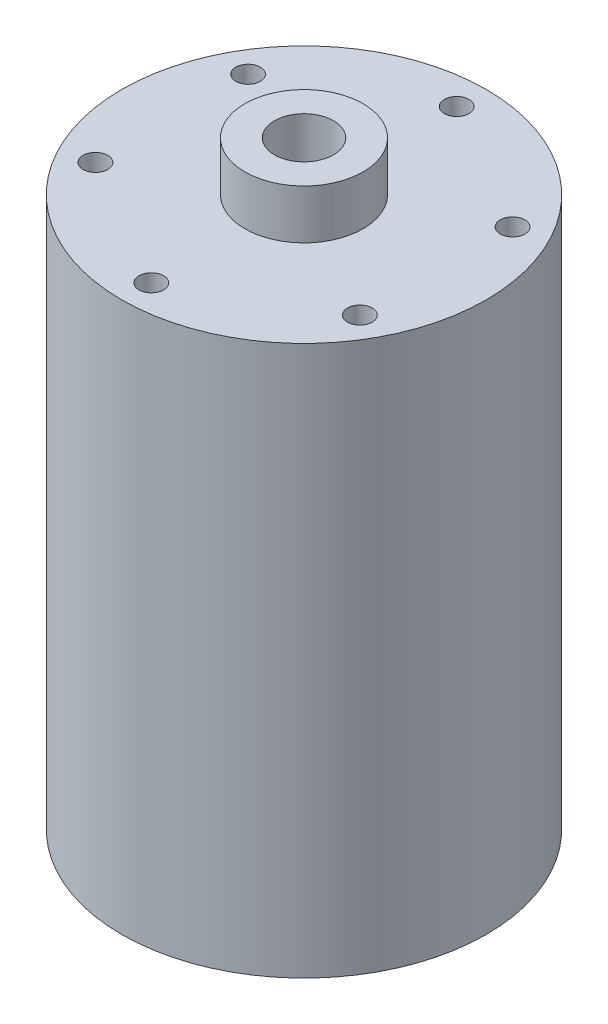
ISO-10303-21;
HEADER;
FILE_DESCRIPTION(('STEP AP214'),'2;1');
FILE_NAME('part.step','',(''),(''),'','','');
FILE_SCHEMA(('AUTOMOTIVE_DESIGN { 1 0 10303 214 1 1 1 1 }'));
ENDSEC;
DATA;
#1=APPLICATION_CONTEXT('core data for automotive mechanical design processes');
#2=APPLICATION_PROTOCOL_DEFINITION('international standard','automotive_design',2000,#1);
#3=PRODUCT_CONTEXT('',#1,'mechanical');
#4=PRODUCT('Part','Part','',(#3));
#5=PRODUCT_RELATED_PRODUCT_CATEGORY('part','',(#4));
#6=PRODUCT_DEFINITION_FORMATION('','',#4);
#7=PRODUCT_DEFINITION_CONTEXT('part definition',#1,'design');
#8=PRODUCT_DEFINITION('design','',#6,#7);
#9=PRODUCT_DEFINITION_SHAPE('','',#8);
#10=(LENGTH_UNIT() NAMED_UNIT(*) SI_UNIT(.MILLI.,.METRE.));
#11=(NAMED_UNIT(*) PLANE_ANGLE_UNIT() SI_UNIT($,.RADIAN.));
#12=(NAMED_UNIT(*) SI_UNIT($,.STERADIAN.) SOLID_ANGLE_UNIT());
#13=UNCERTAINTY_MEASURE_WITH_UNIT(LENGTH_MEASURE(1.E-05),#10,'distance_accuracy_value','');
#14=(GEOMETRIC_REPRESENTATION_CONTEXT(3) GLOBAL_UNCERTAINTY_ASSIGNED_CONTEXT((#13)) GLOBAL_UNIT_ASSIGNED_CONTEXT((#10,
#11,#12)) REPRESENTATION_CONTEXT('',''));
#15=CARTESIAN_POINT('',(0.,0.,0.));
#16=DIRECTION('',(0.,0.,1.));
#17=DIRECTION('',(1.,0.,0.));
#18=AXIS2_PLACEMENT_3D('',#15,#16,#17);
#19=CARTESIAN_POINT('',(0.,55.8,0.));
#20=DIRECTION('',(0.,-1.,0.));
#21=DIRECTION('',(0.,0.,-1.));
#22=AXIS2_PLACEMENT_3D('',#19,#20,#21);
#23=CYLINDRICAL_SURFACE('',#22,18.5);
#24=CARTESIAN_POINT('',(0.,55.8,0.));
#25=DIRECTION('',(0.,1.,0.));
#26=DIRECTION('',(0.,0.,1.));
#27=AXIS2_PLACEMENT_3D('',#24,#25,#26);
#28=CIRCLE('',#27,18.5);
#29=CARTESIAN_POINT('',(0.,55.8,18.5));
#30=VERTEX_POINT('',#29);
#31=EDGE_CURVE('E54',#30,#30,#28,.T.);
#32=ORIENTED_EDGE('',*,*,#31,.F.);
#33=EDGE_LOOP('',(#32));
#34=FACE_BOUND('',#33,.T.);
#35=CARTESIAN_POINT('',(0.,0.,0.));
#36=DIRECTION('',(0.,1.,0.));
#37=DIRECTION('',(0.,0.,1.));
#38=AXIS2_PLACEMENT_3D('',#35,#36,#37);
#39=CIRCLE('',#38,18.5);
#40=CARTESIAN_POINT('',(0.,0.,18.5));
#41=VERTEX_POINT('',#40);
#42=EDGE_CURVE('E48',#41,#41,#39,.T.);
#43=ORIENTED_EDGE('',*,*,#42,.T.);
#44=EDGE_LOOP('',(#43));
#45=FACE_BOUND('',#44,.T.);
#46=ADVANCED_FACE('F45',(#34,#45),#23,.T.);
#47=CARTESIAN_POINT('',(0.,55.8,0.));
#48=DIRECTION('',(0.,1.,0.));
#49=DIRECTION('',(0.,0.,1.));
#50=AXIS2_PLACEMENT_3D('',#47,#48,#49);
#51=PLANE('',#50);
#52=CARTESIAN_POINT('',(0.,55.8,-15.5));
#53=DIRECTION('',(0.,1.,0.));
#54=DIRECTION('',(0.,0.,1.));
#55=AXIS2_PLACEMENT_3D('',#52,#53,#54);
#56=CIRCLE('',#55,1.24999999999999);
#57=CARTESIAN_POINT('',(0.,55.8,-14.25));
#58=VERTEX_POINT('',#57);
#59=EDGE_CURVE('E86',#58,#58,#56,.T.);
#60=ORIENTED_EDGE('',*,*,#59,.F.);
#61=EDGE_LOOP('',(#60));
#62=FACE_BOUND('',#61,.T.);
#63=CARTESIAN_POINT('',(13.423393758659,55.8,-7.75000000000038));
#64=DIRECTION('',(0.,1.,0.));
#65=DIRECTION('',(0.,0.,1.));
#66=AXIS2_PLACEMENT_3D('',#63,#64,#65);
#67=CIRCLE('',#66,1.24999999999999);
#68=CARTESIAN_POINT('',(13.423393758659,55.8,-6.50000000000039));
#69=VERTEX_POINT('',#68);
#70=EDGE_CURVE('E85',#69,#69,#67,.T.);
#71=ORIENTED_EDGE('',*,*,#70,.F.);
#72=EDGE_LOOP('',(#71));
#73=FACE_BOUND('',#72,.T.);
#74=CARTESIAN_POINT('',(13.4233937586595,55.8,7.74999999999962));
#75=DIRECTION('',(0.,1.,0.));
#76=DIRECTION('',(0.,0.,1.));
#77=AXIS2_PLACEMENT_3D('',#74,#75,#76);
#78=CIRCLE('',#77,1.24999999999999);
#79=CARTESIAN_POINT('',(13.4233937586595,55.8,8.99999999999961));
#80=VERTEX_POINT('',#79);
#81=EDGE_CURVE('E101',#80,#80,#78,.T.);
#82=ORIENTED_EDGE('',*,*,#81,.F.);
#83=EDGE_LOOP('',(#82));
#84=FACE_BOUND('',#83,.T.);
#85=CARTESIAN_POINT('',(8.77276587265167E-13,55.8,15.5));
#86=DIRECTION('',(0.,1.,0.));
#87=DIRECTION('',(0.,0.,1.));
#88=AXIS2_PLACEMENT_3D('',#85,#86,#87);
#89=CIRCLE('',#88,1.24999999999999);
#90=CARTESIAN_POINT('',(8.77276587265167E-13,55.8,16.75));
#91=VERTEX_POINT('',#90);
#92=EDGE_CURVE('E109',#91,#91,#89,.T.);
#93=ORIENTED_EDGE('',*,*,#92,.F.);
#94=EDGE_LOOP('',(#93));
#95=FACE_BOUND('',#94,.T.);
#96=CARTESIAN_POINT('',(-13.4233937586581,55.8,7.75000000000039));
#97=DIRECTION('',(0.,1.,0.));
#98=DIRECTION('',(0.,0.,1.));
#99=AXIS2_PLACEMENT_3D('',#96,#97,#98);
#100=CIRCLE('',#99,1.24999999999999);
#101=CARTESIAN_POINT('',(-13.4233937586581,55.8,9.00000000000038));
#102=VERTEX_POINT('',#101);
#103=EDGE_CURVE('E117',#102,#102,#100,.T.);
#104=ORIENTED_EDGE('',*,*,#103,.F.);
#105=EDGE_LOOP('',(#104));
#106=FACE_BOUND('',#105,.T.);
#107=CARTESIAN_POINT('',(-13.4233937586586,55.8,-7.74999999999962));
#108=DIRECTION('',(0.,1.,0.));
#109=DIRECTION('',(0.,0.,1.));
#110=AXIS2_PLACEMENT_3D('',#107,#108,#109);
#111=CIRCLE('',#110,1.24999999999999);
#112=CARTESIAN_POINT('',(-13.4233937586586,55.8,-6.49999999999963));
#113=VERTEX_POINT('',#112);
#114=EDGE_CURVE('E125',#113,#113,#111,.T.);
#115=ORIENTED_EDGE('',*,*,#114,.F.);
#116=EDGE_LOOP('',(#115));
#117=FACE_BOUND('',#116,.T.);
#118=CARTESIAN_POINT('',(0.,55.8,0.));
#119=DIRECTION('',(0.,1.,0.));
#120=DIRECTION('',(0.,0.,1.));
#121=AXIS2_PLACEMENT_3D('',#118,#119,#120);
#122=CIRCLE('',#121,6.);
#123=CARTESIAN_POINT('',(0.,55.8,6.));
#124=VERTEX_POINT('',#123);
#125=EDGE_CURVE('E11',#124,#124,#122,.T.);
#126=ORIENTED_EDGE('',*,*,#125,.F.);
#127=EDGE_LOOP('',(#126));
#128=FACE_BOUND('',#127,.T.);
#129=ORIENTED_EDGE('',*,*,#31,.T.);
#130=EDGE_LOOP('',(#129));
#131=FACE_BOUND('',#130,.T.);
#132=ADVANCED_FACE('F148',(#62,#73,#84,#95,#106,#117,#128,#131),#51,.T.);
#133=CARTESIAN_POINT('',(0.,0.,0.));
#134=DIRECTION('',(0.,1.,0.));
#135=DIRECTION('',(0.,0.,1.));
#136=AXIS2_PLACEMENT_3D('',#133,#134,#135);
#137=PLANE('',#136);
#138=ORIENTED_EDGE('',*,*,#42,.F.);
#139=EDGE_LOOP('',(#138));
#140=FACE_BOUND('',#139,.T.);
#141=ADVANCED_FACE('F145',(#140),#137,.F.);
#142=CARTESIAN_POINT('',(0.,60.8,0.));
#143=DIRECTION('',(0.,-1.,0.));
#144=DIRECTION('',(0.,0.,-1.));
#145=AXIS2_PLACEMENT_3D('',#142,#143,#144);
#146=CYLINDRICAL_SURFACE('',#145,6.);
#147=CARTESIAN_POINT('',(0.,60.8,0.));
#148=DIRECTION('',(0.,1.,0.));
#149=DIRECTION('',(0.,0.,1.));
#150=AXIS2_PLACEMENT_3D('',#147,#148,#149);
#151=CIRCLE('',#150,6.);
#152=CARTESIAN_POINT('',(0.,60.8,6.));
#153=VERTEX_POINT('',#152);
#154=EDGE_CURVE('E133',#153,#153,#151,.T.);
#155=ORIENTED_EDGE('',*,*,#154,.F.);
#156=EDGE_LOOP('',(#155));
#157=FACE_BOUND('',#156,.T.);
#158=ORIENTED_EDGE('',*,*,#125,.T.);
#159=EDGE_LOOP('',(#158));
#160=FACE_BOUND('',#159,.T.);
#161=ADVANCED_FACE('F147',(#157,#160),#146,.T.);
#162=CARTESIAN_POINT('',(0.,60.8,0.));
#163=DIRECTION('',(0.,1.,0.));
#164=DIRECTION('',(0.,0.,1.));
#165=AXIS2_PLACEMENT_3D('',#162,#163,#164);
#166=PLANE('',#165);
#167=CARTESIAN_POINT('',(0.,60.8,0.));
#168=DIRECTION('',(0.,1.,0.));
#169=DIRECTION('',(0.,0.,1.));
#170=AXIS2_PLACEMENT_3D('',#167,#168,#169);
#171=CIRCLE('',#170,3.);
#172=CARTESIAN_POINT('',(0.,60.8,3.));
#173=VERTEX_POINT('',#172);
#174=EDGE_CURVE('E381',#173,#173,#171,.T.);
#175=ORIENTED_EDGE('',*,*,#174,.F.);
#176=EDGE_LOOP('',(#175));
#177=FACE_BOUND('',#176,.T.);
#178=ORIENTED_EDGE('',*,*,#154,.T.);
#179=EDGE_LOOP('',(#178));
#180=FACE_BOUND('',#179,.T.);
#181=ADVANCED_FACE('F153',(#177,#180),#166,.T.);
#182=CARTESIAN_POINT('',(-13.4233937586586,45.13,-7.74999999999962));
#183=DIRECTION('',(0.,1.,0.));
#184=DIRECTION('',(0.,0.,1.));
#185=AXIS2_PLACEMENT_3D('',#182,#183,#184);
#186=CONICAL_SURFACE('',#185,1.24999999999999,1.02974425867665);
#187=CARTESIAN_POINT('',(-13.4233937586586,44.3789242262156,-7.74999999999962));
#188=VERTEX_POINT('',#187);
#189=VERTEX_LOOP('',#188);
#190=FACE_BOUND('',#189,.T.);
#191=CARTESIAN_POINT('',(-13.4233937586586,45.13,-7.74999999999962));
#192=DIRECTION('',(0.,1.,0.));
#193=DIRECTION('',(0.,0.,1.));
#194=AXIS2_PLACEMENT_3D('',#191,#192,#193);
#195=CIRCLE('',#194,1.24999999999999);
#196=CARTESIAN_POINT('',(-13.4233937586586,45.13,-6.49999999999964));
#197=VERTEX_POINT('',#196);
#198=EDGE_CURVE('E129',#197,#197,#195,.T.);
#199=ORIENTED_EDGE('',*,*,#198,.T.);
#200=EDGE_LOOP('',(#199));
#201=FACE_BOUND('',#200,.T.);
#202=ADVANCED_FACE('F178',(#190,#201),#186,.F.);
#203=CARTESIAN_POINT('',(-13.4233937586586,55.8,-7.74999999999962));
#204=DIRECTION('',(0.,1.,0.));
#205=DIRECTION('',(0.,0.,1.));
#206=AXIS2_PLACEMENT_3D('',#203,#204,#205);
#207=CYLINDRICAL_SURFACE('',#206,1.24999999999999);
#208=ORIENTED_EDGE('',*,*,#198,.F.);
#209=EDGE_LOOP('',(#208));
#210=FACE_BOUND('',#209,.T.);
#211=ORIENTED_EDGE('',*,*,#114,.T.);
#212=EDGE_LOOP('',(#211));
#213=FACE_BOUND('',#212,.T.);
#214=ADVANCED_FACE('F172',(#210,#213),#207,.F.);
#215=CARTESIAN_POINT('',(-13.4233937586581,45.13,7.75000000000039));
#216=DIRECTION('',(0.,1.,0.));
#217=DIRECTION('',(0.,0.,1.));
#218=AXIS2_PLACEMENT_3D('',#215,#216,#217);
#219=CONICAL_SURFACE('',#218,1.24999999999999,1.02974425867665);
#220=CARTESIAN_POINT('',(-13.4233937586581,44.3789242262156,7.75000000000039));
#221=VERTEX_POINT('',#220);
#222=VERTEX_LOOP('',#221);
#223=FACE_BOUND('',#222,.T.);
#224=CARTESIAN_POINT('',(-13.4233937586581,45.13,7.75000000000039));
#225=DIRECTION('',(0.,1.,0.));
#226=DIRECTION('',(0.,0.,1.));
#227=AXIS2_PLACEMENT_3D('',#224,#225,#226);
#228=CIRCLE('',#227,1.24999999999999);
#229=CARTESIAN_POINT('',(-13.4233937586581,45.13,9.00000000000037));
#230=VERTEX_POINT('',#229);
#231=EDGE_CURVE('E121',#230,#230,#228,.T.);
#232=ORIENTED_EDGE('',*,*,#231,.T.);
#233=EDGE_LOOP('',(#232));
#234=FACE_BOUND('',#233,.T.);
#235=ADVANCED_FACE('F177',(#223,#234),#219,.F.);
#236=CARTESIAN_POINT('',(-13.4233937586581,55.8,7.75000000000039));
#237=DIRECTION('',(0.,1.,0.));
#238=DIRECTION('',(0.,0.,1.));
#239=AXIS2_PLACEMENT_3D('',#236,#237,#238);
#240=CYLINDRICAL_SURFACE('',#239,1.24999999999999);
#241=ORIENTED_EDGE('',*,*,#231,.F.);
#242=EDGE_LOOP('',(#241));
#243=FACE_BOUND('',#242,.T.);
#244=ORIENTED_EDGE('',*,*,#103,.T.);
#245=EDGE_LOOP('',(#244));
#246=FACE_BOUND('',#245,.T.);
#247=ADVANCED_FACE('F187',(#243,#246),#240,.F.);
#248=CARTESIAN_POINT('',(8.77276587265167E-13,45.13,15.5));
#249=DIRECTION('',(0.,1.,0.));
#250=DIRECTION('',(0.,0.,1.));
#251=AXIS2_PLACEMENT_3D('',#248,#249,#250);
#252=CONICAL_SURFACE('',#251,1.24999999999999,1.02974425867665);
#253=CARTESIAN_POINT('',(8.7447923048733E-13,44.3789242262156,15.5));
#254=VERTEX_POINT('',#253);
#255=VERTEX_LOOP('',#254);
#256=FACE_BOUND('',#255,.T.);
#257=CARTESIAN_POINT('',(8.77276587265167E-13,45.13,15.5));
#258=DIRECTION('',(0.,1.,0.));
#259=DIRECTION('',(0.,0.,1.));
#260=AXIS2_PLACEMENT_3D('',#257,#258,#259);
#261=CIRCLE('',#260,1.24999999999999);
#262=CARTESIAN_POINT('',(8.77276587265167E-13,45.13,16.75));
#263=VERTEX_POINT('',#262);
#264=EDGE_CURVE('E113',#263,#263,#261,.T.);
#265=ORIENTED_EDGE('',*,*,#264,.T.);
#266=EDGE_LOOP('',(#265));
#267=FACE_BOUND('',#266,.T.);
#268=ADVANCED_FACE('F192',(#256,#267),#252,.F.);
#269=CARTESIAN_POINT('',(8.77276587265167E-13,55.8,15.5));
#270=DIRECTION('',(0.,1.,0.));
#271=DIRECTION('',(0.,0.,1.));
#272=AXIS2_PLACEMENT_3D('',#269,#270,#271);
#273=CYLINDRICAL_SURFACE('',#272,1.24999999999999);
#274=ORIENTED_EDGE('',*,*,#264,.F.);
#275=EDGE_LOOP('',(#274));
#276=FACE_BOUND('',#275,.T.);
#277=ORIENTED_EDGE('',*,*,#92,.T.);
#278=EDGE_LOOP('',(#277));
#279=FACE_BOUND('',#278,.T.);
#280=ADVANCED_FACE('F201',(#276,#279),#273,.F.);
#281=CARTESIAN_POINT('',(13.4233937586595,45.13,7.74999999999962));
#282=DIRECTION('',(0.,1.,0.));
#283=DIRECTION('',(0.,0.,1.));
#284=AXIS2_PLACEMENT_3D('',#281,#282,#283);
#285=CONICAL_SURFACE('',#284,1.24999999999999,1.02974425867665);
#286=CARTESIAN_POINT('',(13.4233937586595,44.3789242262156,7.74999999999962));
#287=VERTEX_POINT('',#286);
#288=VERTEX_LOOP('',#287);
#289=FACE_BOUND('',#288,.T.);
#290=CARTESIAN_POINT('',(13.4233937586595,45.13,7.74999999999962));
#291=DIRECTION('',(0.,1.,0.));
#292=DIRECTION('',(0.,0.,1.));
#293=AXIS2_PLACEMENT_3D('',#290,#291,#292);
#294=CIRCLE('',#293,1.24999999999999);
#295=CARTESIAN_POINT('',(13.4233937586595,45.13,8.99999999999961));
#296=VERTEX_POINT('',#295);
#297=EDGE_CURVE('E105',#296,#296,#294,.T.);
#298=ORIENTED_EDGE('',*,*,#297,.T.);
#299=EDGE_LOOP('',(#298));
#300=FACE_BOUND('',#299,.T.);
#301=ADVANCED_FACE('F206',(#289,#300),#285,.F.);
#302=CARTESIAN_POINT('',(13.4233937586595,55.8,7.74999999999962));
#303=DIRECTION('',(0.,1.,0.));
#304=DIRECTION('',(0.,0.,1.));
#305=AXIS2_PLACEMENT_3D('',#302,#303,#304);
#306=CYLINDRICAL_SURFACE('',#305,1.24999999999999);
#307=ORIENTED_EDGE('',*,*,#297,.F.);
#308=EDGE_LOOP('',(#307));
#309=FACE_BOUND('',#308,.T.);
#310=ORIENTED_EDGE('',*,*,#81,.T.);
#311=EDGE_LOOP('',(#310));
#312=FACE_BOUND('',#311,.T.);
#313=ADVANCED_FACE('F215',(#309,#312),#306,.F.);
#314=CARTESIAN_POINT('',(13.423393758659,45.13,-7.75000000000038));
#315=DIRECTION('',(0.,1.,0.));
#316=DIRECTION('',(0.,0.,1.));
#317=AXIS2_PLACEMENT_3D('',#314,#315,#316);
#318=CONICAL_SURFACE('',#317,1.24999999999999,1.02974425867665);
#319=CARTESIAN_POINT('',(13.423393758659,44.3789242262156,-7.75000000000038));
#320=VERTEX_POINT('',#319);
#321=VERTEX_LOOP('',#320);
#322=FACE_BOUND('',#321,.T.);
#323=CARTESIAN_POINT('',(13.423393758659,45.13,-7.75000000000038));
#324=DIRECTION('',(0.,1.,0.));
#325=DIRECTION('',(0.,0.,1.));
#326=AXIS2_PLACEMENT_3D('',#323,#324,#325);
#327=CIRCLE('',#326,1.24999999999999);
#328=CARTESIAN_POINT('',(13.423393758659,45.13,-6.50000000000039));
#329=VERTEX_POINT('',#328);
#330=EDGE_CURVE('E91',#329,#329,#327,.T.);
#331=ORIENTED_EDGE('',*,*,#330,.T.);
#332=EDGE_LOOP('',(#331));
#333=FACE_BOUND('',#332,.T.);
#334=ADVANCED_FACE('F220',(#322,#333),#318,.F.);
#335=CARTESIAN_POINT('',(13.423393758659,55.8,-7.75000000000038));
#336=DIRECTION('',(0.,1.,0.));
#337=DIRECTION('',(0.,0.,1.));
#338=AXIS2_PLACEMENT_3D('',#335,#336,#337);
#339=CYLINDRICAL_SURFACE('',#338,1.24999999999999);
#340=ORIENTED_EDGE('',*,*,#330,.F.);
#341=EDGE_LOOP('',(#340));
#342=FACE_BOUND('',#341,.T.);
#343=ORIENTED_EDGE('',*,*,#70,.T.);
#344=EDGE_LOOP('',(#343));
#345=FACE_BOUND('',#344,.T.);
#346=ADVANCED_FACE('F78',(#342,#345),#339,.F.);
#347=CARTESIAN_POINT('',(0.,45.13,-15.5));
#348=DIRECTION('',(0.,1.,0.));
#349=DIRECTION('',(0.,0.,1.));
#350=AXIS2_PLACEMENT_3D('',#347,#348,#349);
#351=CONICAL_SURFACE('',#350,1.24999999999999,1.02974425867665);
#352=CARTESIAN_POINT('',(0.,44.3789242262156,-15.5));
#353=VERTEX_POINT('',#352);
#354=VERTEX_LOOP('',#353);
#355=FACE_BOUND('',#354,.T.);
#356=CARTESIAN_POINT('',(0.,45.13,-15.5));
#357=DIRECTION('',(0.,1.,0.));
#358=DIRECTION('',(0.,0.,1.));
#359=AXIS2_PLACEMENT_3D('',#356,#357,#358);
#360=CIRCLE('',#359,1.24999999999999);
#361=CARTESIAN_POINT('',(0.,45.13,-14.25));
#362=VERTEX_POINT('',#361);
#363=EDGE_CURVE('E82',#362,#362,#360,.T.);
#364=ORIENTED_EDGE('',*,*,#363,.T.);
#365=EDGE_LOOP('',(#364));
#366=FACE_BOUND('',#365,.T.);
#367=ADVANCED_FACE('F74',(#355,#366),#351,.F.);
#368=CARTESIAN_POINT('',(0.,55.8,-15.5));
#369=DIRECTION('',(0.,1.,0.));
#370=DIRECTION('',(0.,0.,1.));
#371=AXIS2_PLACEMENT_3D('',#368,#369,#370);
#372=CYLINDRICAL_SURFACE('',#371,1.24999999999999);
#373=ORIENTED_EDGE('',*,*,#363,.F.);
#374=EDGE_LOOP('',(#373));
#375=FACE_BOUND('',#374,.T.);
#376=ORIENTED_EDGE('',*,*,#59,.T.);
#377=EDGE_LOOP('',(#376));
#378=FACE_BOUND('',#377,.T.);
#379=ADVANCED_FACE('F77',(#375,#378),#372,.F.);
#380=CARTESIAN_POINT('',(0.,55.8,0.));
#381=DIRECTION('',(0.,1.,0.));
#382=DIRECTION('',(0.,0.,1.));
#383=AXIS2_PLACEMENT_3D('',#380,#381,#382);
#384=CYLINDRICAL_SURFACE('',#383,3.);
#385=CARTESIAN_POINT('',(0.,55.8,0.));
#386=DIRECTION('',(0.,1.,0.));
#387=DIRECTION('',(0.,0.,1.));
#388=AXIS2_PLACEMENT_3D('',#385,#386,#387);
#389=CIRCLE('',#388,3.);
#390=CARTESIAN_POINT('',(0.,55.8,3.));
#391=VERTEX_POINT('',#390);
#392=EDGE_CURVE('E94',#391,#391,#389,.T.);
#393=ORIENTED_EDGE('',*,*,#392,.F.);
#394=EDGE_LOOP('',(#393));
#395=FACE_BOUND('',#394,.T.);
#396=ORIENTED_EDGE('',*,*,#174,.T.);
#397=EDGE_LOOP('',(#396));
#398=FACE_BOUND('',#397,.T.);
#399=ADVANCED_FACE('F242',(#395,#398),#384,.F.);
#400=CARTESIAN_POINT('',(0.,55.8,0.));
#401=DIRECTION('',(0.,1.,0.));
#402=DIRECTION('',(0.,0.,1.));
#403=AXIS2_PLACEMENT_3D('',#400,#401,#402);
#404=PLANE('',#403);
#405=ORIENTED_EDGE('',*,*,#392,.T.);
#406=EDGE_LOOP('',(#405));
#407=FACE_BOUND('',#406,.T.);
#408=ADVANCED_FACE('F253',(#407),#404,.T.);
#409=CLOSED_SHELL('',(#46,#132,#141,#161,#181,#202,#214,#235,#247,#268,#280,#301,#313,#334,#346,
#367,#379,#399,#408));
#410=MANIFOLD_SOLID_BREP('B2',#409);
#411=ADVANCED_BREP_SHAPE_REPRESENTATION('',(#18,#410),#14);
#412=SHAPE_DEFINITION_REPRESENTATION(#9,#411);
ENDSEC;
END-ISO-10303-21;
